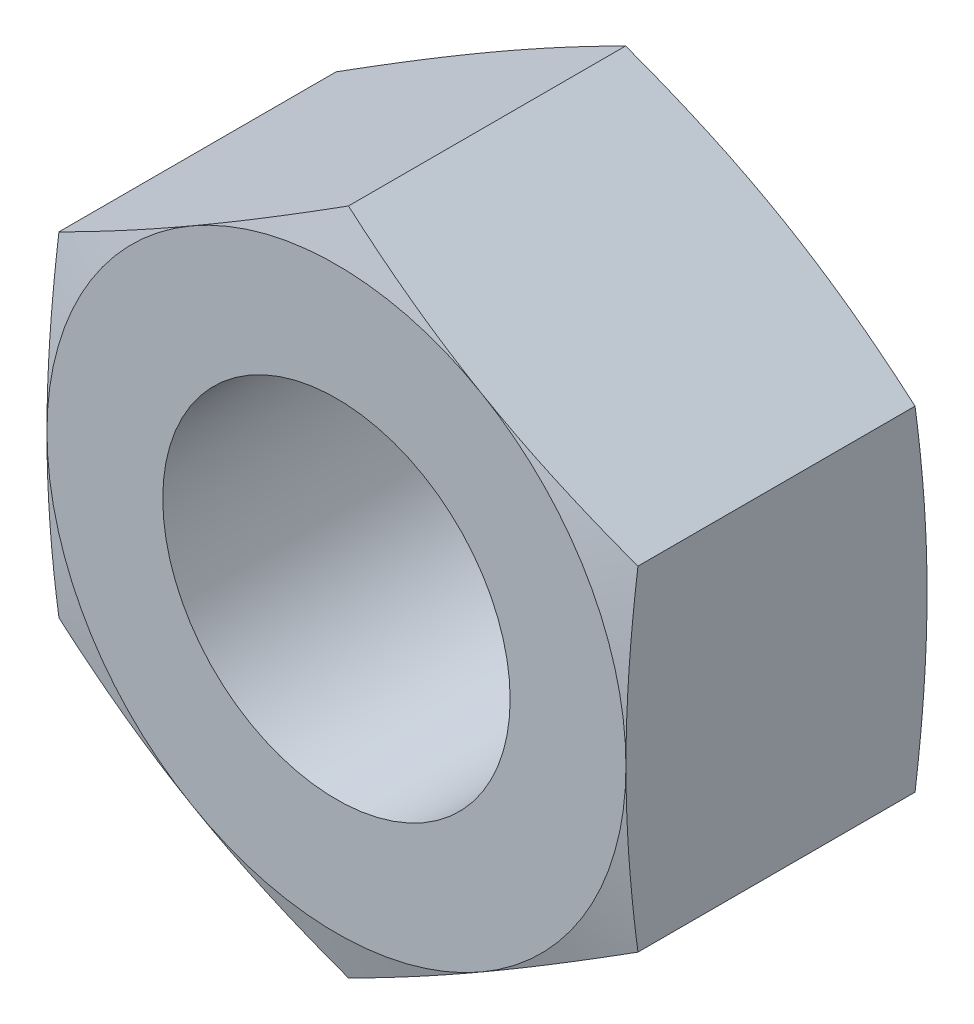
ISO-10303-21;
HEADER;
FILE_DESCRIPTION(('STEP AP214'),'2;1');
FILE_NAME('part.step','',(''),(''),'','','');
FILE_SCHEMA(('AUTOMOTIVE_DESIGN { 1 0 10303 214 1 1 1 1 }'));
ENDSEC;
DATA;
#1=APPLICATION_CONTEXT('core data for automotive mechanical design processes');
#2=APPLICATION_PROTOCOL_DEFINITION('international standard','automotive_design',2000,#1);
#3=PRODUCT_CONTEXT('',#1,'mechanical');
#4=PRODUCT('Part','Part','',(#3));
#5=PRODUCT_RELATED_PRODUCT_CATEGORY('part','',(#4));
#6=PRODUCT_DEFINITION_FORMATION('','',#4);
#7=PRODUCT_DEFINITION_CONTEXT('part definition',#1,'design');
#8=PRODUCT_DEFINITION('design','',#6,#7);
#9=PRODUCT_DEFINITION_SHAPE('','',#8);
#10=(LENGTH_UNIT() NAMED_UNIT(*) SI_UNIT(.MILLI.,.METRE.));
#11=(NAMED_UNIT(*) PLANE_ANGLE_UNIT() SI_UNIT($,.RADIAN.));
#12=(NAMED_UNIT(*) SI_UNIT($,.STERADIAN.) SOLID_ANGLE_UNIT());
#13=UNCERTAINTY_MEASURE_WITH_UNIT(LENGTH_MEASURE(1.E-05),#10,'distance_accuracy_value','');
#14=(GEOMETRIC_REPRESENTATION_CONTEXT(3) GLOBAL_UNCERTAINTY_ASSIGNED_CONTEXT((#13)) GLOBAL_UNIT_ASSIGNED_CONTEXT((#10,
#11,#12)) REPRESENTATION_CONTEXT('',''));
#15=CARTESIAN_POINT('',(0.,0.,0.));
#16=DIRECTION('',(0.,0.,1.));
#17=DIRECTION('',(1.,0.,0.));
#18=AXIS2_PLACEMENT_3D('',#15,#16,#17);
#19=CARTESIAN_POINT('',(5.,2.88675134594813,5.2));
#20=DIRECTION('',(-0.5,-0.866025403784439,0.));
#21=DIRECTION('',(0.866025403784439,-0.5,0.));
#22=AXIS2_PLACEMENT_3D('',#19,#20,#21);
#23=PLANE('',#22);
#24=CARTESIAN_POINT('',(-0.0002,5.7736181619501,0.207290362672768));
#25=CARTESIAN_POINT('',(0.207454004305664,5.65372906666592,0.175152096183013));
#26=CARTESIAN_POINT('',(0.415484518325708,5.53362259339679,0.145975813023445));
#27=CARTESIAN_POINT('',(0.832280248969818,5.29298546611232,0.0947157701800614));
#28=CARTESIAN_POINT('',(1.04104572932974,5.17245465982902,0.0726348915691702));
#29=CARTESIAN_POINT('',(1.45804559853969,4.93169967308862,0.0368547678462025));
#30=CARTESIAN_POINT('',(1.66627716741308,4.81147712074579,0.0231128518667938));
#31=CARTESIAN_POINT('',(2.08300586365709,4.57087869579027,0.00468634420395456));
#32=CARTESIAN_POINT('',(2.29150293182854,4.45050285735623,0.));
#33=CARTESIAN_POINT('',(2.70849706817146,4.20975118048815,0.));
#34=CARTESIAN_POINT('',(2.91699413634292,4.08937534205412,0.00468634420395369));
#35=CARTESIAN_POINT('',(3.33372283258692,3.8487769170986,0.023112851866792));
#36=CARTESIAN_POINT('',(3.54195440146031,3.72855436475577,0.0368547678462003));
#37=CARTESIAN_POINT('',(3.95895427067026,3.48779937801536,0.0726348915691672));
#38=CARTESIAN_POINT('',(4.16771975103018,3.36726857173206,0.0947157701800582));
#39=CARTESIAN_POINT('',(4.58451548167429,3.1266314444476,0.145975813023441));
#40=CARTESIAN_POINT('',(4.79254599569434,3.00652497117847,0.175152096183008));
#41=CARTESIAN_POINT('',(5.0002,2.88663587589429,0.207290362672762));
#42=B_SPLINE_CURVE_WITH_KNOTS('',3,(#24,#25,#26,#27,#28,#29,#30,#31,#32,#33,#34,#35,#36,#37,#38,
#39,#40,#41),.UNSPECIFIED.,.F.,.F.,(4,2,2,2,2,2,2,2,4),(0.,0.725805237679808,1.45190481561532,
2.17425686883392,2.89646911159516,3.6186813543564,4.34103340757501,5.06713298551051,
5.79293822319032),.UNSPECIFIED.);
#43=CARTESIAN_POINT('',(0.,5.77350269189626,0.207259421636907));
#44=VERTEX_POINT('',#43);
#45=CARTESIAN_POINT('',(2.50000000000003,4.33012701892218,0.));
#46=VERTEX_POINT('',#45);
#47=EDGE_CURVE('E49',#44,#46,#42,.T.);
#48=ORIENTED_EDGE('',*,*,#47,.F.);
#49=DIRECTION('',(0.,0.,-1.));
#50=VECTOR('',#49,1.);
#51=CARTESIAN_POINT('',(0.,5.77350269189626,5.2));
#52=LINE('',#51,#50);
#53=CARTESIAN_POINT('',(0.,5.77350269189626,4.99274057836309));
#54=VERTEX_POINT('',#53);
#55=EDGE_CURVE('E164',#54,#44,#52,.T.);
#56=ORIENTED_EDGE('',*,*,#55,.F.);
#57=CARTESIAN_POINT('',(5.0002,2.88663587589429,4.99270963732724));
#58=CARTESIAN_POINT('',(4.79254599569434,3.00652497117847,5.02484790381699));
#59=CARTESIAN_POINT('',(4.58451548167429,3.1266314444476,5.05402418697656));
#60=CARTESIAN_POINT('',(4.16771975103018,3.36726857173206,5.10528422981994));
#61=CARTESIAN_POINT('',(3.95895427067026,3.48779937801536,5.12736510843083));
#62=CARTESIAN_POINT('',(3.54195440146031,3.72855436475577,5.1631452321538));
#63=CARTESIAN_POINT('',(3.33372283258692,3.8487769170986,5.17688714813321));
#64=CARTESIAN_POINT('',(2.91699413634291,4.08937534205412,5.19531365579605));
#65=CARTESIAN_POINT('',(2.70849706817146,4.20975118048815,5.19999999999999));
#66=CARTESIAN_POINT('',(2.29150293182854,4.45050285735623,5.19999999999999));
#67=CARTESIAN_POINT('',(2.08300586365709,4.57087869579027,5.19531365579604));
#68=CARTESIAN_POINT('',(1.66627716741308,4.81147712074579,5.17688714813321));
#69=CARTESIAN_POINT('',(1.45804559853969,4.93169967308862,5.1631452321538));
#70=CARTESIAN_POINT('',(1.04104572932974,5.17245465982902,5.12736510843083));
#71=CARTESIAN_POINT('',(0.832280248969818,5.29298546611232,5.10528422981994));
#72=CARTESIAN_POINT('',(0.415484518325708,5.53362259339679,5.05402418697655));
#73=CARTESIAN_POINT('',(0.207454004305665,5.65372906666592,5.02484790381699));
#74=CARTESIAN_POINT('',(-0.00020000000000044,5.7736181619501,4.99270963732723));
#75=B_SPLINE_CURVE_WITH_KNOTS('',3,(#57,#58,#59,#60,#61,#62,#63,#64,#65,#66,#67,#68,#69,#70,#71,
#72,#73,#74),.UNSPECIFIED.,.F.,.F.,(4,2,2,2,2,2,2,2,4),(0.,0.725805237679808,1.45190481561532,
2.17425686883392,2.89646911159516,3.6186813543564,4.34103340757501,5.06713298551051,
5.79293822319032),.UNSPECIFIED.);
#76=CARTESIAN_POINT('',(2.50000000000001,4.33012701892219,5.19999999999999));
#77=VERTEX_POINT('',#76);
#78=EDGE_CURVE('E223',#77,#54,#75,.T.);
#79=ORIENTED_EDGE('',*,*,#78,.F.);
#80=CARTESIAN_POINT('',(5.,2.88675134594831,4.99274057836346));
#81=VERTEX_POINT('',#80);
#82=EDGE_CURVE('E294',#81,#77,#75,.T.);
#83=ORIENTED_EDGE('',*,*,#82,.F.);
#84=DIRECTION('',(0.,0.,-1.));
#85=VECTOR('',#84,1.);
#86=CARTESIAN_POINT('',(5.,2.88675134594813,5.2));
#87=LINE('',#86,#85);
#88=CARTESIAN_POINT('',(5.,2.88675134594813,0.207259421636902));
#89=VERTEX_POINT('',#88);
#90=EDGE_CURVE('E150',#81,#89,#87,.T.);
#91=ORIENTED_EDGE('',*,*,#90,.T.);
#92=EDGE_CURVE('E143',#46,#89,#42,.T.);
#93=ORIENTED_EDGE('',*,*,#92,.F.);
#94=EDGE_LOOP('',(#48,#56,#79,#83,#91,#93));
#95=FACE_BOUND('',#94,.T.);
#96=ADVANCED_FACE('F33',(#95),#23,.F.);
#97=CARTESIAN_POINT('',(0.,5.77350269189626,5.2));
#98=DIRECTION('',(0.5,-0.866025403784439,0.));
#99=DIRECTION('',(0.866025403784439,0.5,0.));
#100=AXIS2_PLACEMENT_3D('',#97,#98,#99);
#101=PLANE('',#100);
#102=CARTESIAN_POINT('',(-5.0002,2.88663587589429,0.207290362672762));
#103=CARTESIAN_POINT('',(-4.79254599569433,3.00652497117847,0.175152096183008));
#104=CARTESIAN_POINT('',(-4.58451548167429,3.1266314444476,0.14597581302344));
#105=CARTESIAN_POINT('',(-4.16771975103018,3.36726857173206,0.094715770180058));
#106=CARTESIAN_POINT('',(-3.95895427067026,3.48779937801536,0.0726348915691671));
#107=CARTESIAN_POINT('',(-3.54195440146031,3.72855436475577,0.0368547678462002));
#108=CARTESIAN_POINT('',(-3.33372283258692,3.8487769170986,0.0231128518667918));
#109=CARTESIAN_POINT('',(-2.91699413634291,4.08937534205412,0.00468634420395353));
#110=CARTESIAN_POINT('',(-2.70849706817146,4.20975118048815,0.));
#111=CARTESIAN_POINT('',(-2.29150293182854,4.45050285735623,0.));
#112=CARTESIAN_POINT('',(-2.08300586365708,4.57087869579027,0.00468634420395463));
#113=CARTESIAN_POINT('',(-1.66627716741308,4.81147712074579,0.0231128518667938));
#114=CARTESIAN_POINT('',(-1.45804559853969,4.93169967308862,0.0368547678462024));
#115=CARTESIAN_POINT('',(-1.04104572932974,5.17245465982902,0.0726348915691701));
#116=CARTESIAN_POINT('',(-0.832280248969818,5.29298546611232,0.0947157701800615));
#117=CARTESIAN_POINT('',(-0.415484518325707,5.53362259339679,0.145975813023445));
#118=CARTESIAN_POINT('',(-0.207454004305664,5.65372906666592,0.175152096183013));
#119=CARTESIAN_POINT('',(0.000200000000000466,5.7736181619501,0.207290362672768));
#120=B_SPLINE_CURVE_WITH_KNOTS('',3,(#102,#103,#104,#105,#106,#107,#108,#109,#110,#111,#112,
#113,#114,#115,#116,#117,#118,#119),.UNSPECIFIED.,.F.,.F.,(4,2,2,2,2,2,2,2,4),(0.,
0.725805237679807,1.45190481561532,2.17425686883392,2.89646911159516,3.6186813543564,
4.341033407575,5.06713298551051,5.79293822319032),.UNSPECIFIED.);
#121=CARTESIAN_POINT('',(-5.,2.88675134594831,0.207259421636538));
#122=VERTEX_POINT('',#121);
#123=CARTESIAN_POINT('',(-2.49999999999995,4.33012701892223,0.));
#124=VERTEX_POINT('',#123);
#125=EDGE_CURVE('E56',#122,#124,#120,.T.);
#126=ORIENTED_EDGE('',*,*,#125,.F.);
#127=DIRECTION('',(0.,0.,-1.));
#128=VECTOR('',#127,1.);
#129=CARTESIAN_POINT('',(-5.,2.88675134594813,5.2));
#130=LINE('',#129,#128);
#131=CARTESIAN_POINT('',(-5.,2.88675134594813,4.9927405783631));
#132=VERTEX_POINT('',#131);
#133=EDGE_CURVE('E161',#132,#122,#130,.T.);
#134=ORIENTED_EDGE('',*,*,#133,.F.);
#135=CARTESIAN_POINT('',(0.000200000000000032,5.7736181619501,4.99270963732723));
#136=CARTESIAN_POINT('',(-0.207454004305665,5.65372906666592,5.02484790381699));
#137=CARTESIAN_POINT('',(-0.415484518325708,5.53362259339679,5.05402418697655));
#138=CARTESIAN_POINT('',(-0.832280248969818,5.29298546611232,5.10528422981994));
#139=CARTESIAN_POINT('',(-1.04104572932974,5.17245465982902,5.12736510843083));
#140=CARTESIAN_POINT('',(-1.45804559853969,4.93169967308862,5.1631452321538));
#141=CARTESIAN_POINT('',(-1.66627716741308,4.81147712074579,5.17688714813321));
#142=CARTESIAN_POINT('',(-2.08300586365709,4.57087869579027,5.19531365579604));
#143=CARTESIAN_POINT('',(-2.29150293182854,4.45050285735623,5.19999999999999));
#144=CARTESIAN_POINT('',(-2.70849706817146,4.20975118048815,5.19999999999999));
#145=CARTESIAN_POINT('',(-2.91699413634291,4.08937534205412,5.19531365579605));
#146=CARTESIAN_POINT('',(-3.33372283258692,3.8487769170986,5.17688714813321));
#147=CARTESIAN_POINT('',(-3.54195440146031,3.72855436475577,5.1631452321538));
#148=CARTESIAN_POINT('',(-3.95895427067026,3.48779937801536,5.12736510843083));
#149=CARTESIAN_POINT('',(-4.16771975103018,3.36726857173206,5.10528422981994));
#150=CARTESIAN_POINT('',(-4.58451548167429,3.1266314444476,5.05402418697656));
#151=CARTESIAN_POINT('',(-4.79254599569433,3.00652497117847,5.02484790381699));
#152=CARTESIAN_POINT('',(-5.0002,2.88663587589429,4.99270963732724));
#153=B_SPLINE_CURVE_WITH_KNOTS('',3,(#135,#136,#137,#138,#139,#140,#141,#142,#143,#144,#145,
#146,#147,#148,#149,#150,#151,#152),.UNSPECIFIED.,.F.,.F.,(4,2,2,2,2,2,2,2,4),(0.,
0.725805237679808,1.45190481561532,2.17425686883392,2.89646911159516,3.6186813543564,
4.341033407575,5.06713298551051,5.79293822319032),.UNSPECIFIED.);
#154=CARTESIAN_POINT('',(-2.50000000000001,4.33012701892218,5.19999999999999));
#155=VERTEX_POINT('',#154);
#156=EDGE_CURVE('E216',#155,#132,#153,.T.);
#157=ORIENTED_EDGE('',*,*,#156,.F.);
#158=EDGE_CURVE('E221',#54,#155,#153,.T.);
#159=ORIENTED_EDGE('',*,*,#158,.F.);
#160=ORIENTED_EDGE('',*,*,#55,.T.);
#161=EDGE_CURVE('E241',#124,#44,#120,.T.);
#162=ORIENTED_EDGE('',*,*,#161,.F.);
#163=EDGE_LOOP('',(#126,#134,#157,#159,#160,#162));
#164=FACE_BOUND('',#163,.T.);
#165=ADVANCED_FACE('F229',(#164),#101,.F.);
#166=CARTESIAN_POINT('',(-5.,2.88675134594813,5.2));
#167=DIRECTION('',(1.,0.,0.));
#168=DIRECTION('',(0.,0.,-1.));
#169=AXIS2_PLACEMENT_3D('',#166,#167,#168);
#170=PLANE('',#169);
#171=CARTESIAN_POINT('',(-5.,-8.71614548071957,1.35272602911553));
#172=CARTESIAN_POINT('',(-5.,-8.50517178202084,1.30369751464159));
#173=CARTESIAN_POINT('',(-5.,-8.29410295788632,1.25507499520935));
#174=CARTESIAN_POINT('',(-5.,-7.87173515821779,1.15882459396069));
#175=CARTESIAN_POINT('',(-5.,-7.6604361789682,1.11119672845985));
#176=CARTESIAN_POINT('',(-5.,-7.23753268854871,1.01711047025476));
#177=CARTESIAN_POINT('',(-5.,-7.02592812461219,0.970652313953818));
#178=CARTESIAN_POINT('',(-5.,-6.6024125131639,0.879161537356423));
#179=CARTESIAN_POINT('',(-5.,-6.39050146666825,0.834128912344969));
#180=CARTESIAN_POINT('',(-5.,-5.75024834286992,0.700759506089029));
#181=CARTESIAN_POINT('',(-5.,-5.32135127372824,0.615044225670966));
#182=CARTESIAN_POINT('',(-5.,-4.46155937856084,0.453931708322953));
#183=CARTESIAN_POINT('',(-5.,-4.0306643801381,0.378535379591927));
#184=CARTESIAN_POINT('',(-5.,-3.1780351163673,0.245094466846938));
#185=CARTESIAN_POINT('',(-5.,-2.75636838174616,0.186635646797101));
#186=CARTESIAN_POINT('',(-5.,-2.12211174343666,0.114770937262285));
#187=CARTESIAN_POINT('',(-5.,-1.91041927983695,0.0934544967437348));
#188=CARTESIAN_POINT('',(-5.,-1.48651435736496,0.0569212881898627));
#189=CARTESIAN_POINT('',(-5.,-1.27430193557794,0.0417040971840017));
#190=CARTESIAN_POINT('',(-5.,-0.850417950226465,0.0181102252165314));
#191=CARTESIAN_POINT('',(-5.,-0.638748051502393,0.00970406579025167));
#192=CARTESIAN_POINT('',(-5.,-0.215243208172337,4.89659294492869E-05));
#193=CARTESIAN_POINT('',(-5.,-0.0034082643547742,-0.00120000848790474));
#194=CARTESIAN_POINT('',(-5.,0.420195692654403,0.00352629494161619));
#195=CARTESIAN_POINT('',(-5.,0.631964699813662,0.0095021069058838));
#196=CARTESIAN_POINT('',(-5.,1.05518748667662,0.0283659414507137));
#197=CARTESIAN_POINT('',(-5.,1.26664126664026,0.0412539583284184));
#198=CARTESIAN_POINT('',(-5.,1.78023445773328,0.0802632094863383));
#199=CARTESIAN_POINT('',(-5.,2.08212239097341,0.109695187155677));
#200=CARTESIAN_POINT('',(-5.,2.68462938570462,0.179152089281243));
#201=CARTESIAN_POINT('',(-5.,2.98524849340934,0.219176624489041));
#202=CARTESIAN_POINT('',(-5.,3.58620533805987,0.307598597084876));
#203=CARTESIAN_POINT('',(-5.,3.88653918314978,0.356022096383951));
#204=CARTESIAN_POINT('',(-5.,4.48612703405225,0.459159221156393));
#205=CARTESIAN_POINT('',(-5.,4.7853809856308,0.513873158133325));
#206=CARTESIAN_POINT('',(-5.,5.38913044194303,0.629216020438101));
#207=CARTESIAN_POINT('',(-5.,5.69360696243287,0.689943560017453));
#208=CARTESIAN_POINT('',(-5.,6.30179367719117,0.81511802475082));
#209=CARTESIAN_POINT('',(-5.,6.60550386281222,0.879564991681129));
#210=CARTESIAN_POINT('',(-5.,7.2106550215865,1.01092042151158));
#211=CARTESIAN_POINT('',(-5.,7.51209933915072,1.07781354941846));
#212=CARTESIAN_POINT('',(-5.,8.11447382199698,1.21378243523377));
#213=CARTESIAN_POINT('',(-5.,8.41540402192394,1.28285803942017));
#214=CARTESIAN_POINT('',(-5.,8.71614548071957,1.35272602911558));
#215=B_SPLINE_CURVE_WITH_KNOTS('',3,(#171,#172,#173,#174,#175,#176,#177,#178,#179,#180,#181,
#182,#183,#184,#185,#186,#187,#188,#189,#190,#191,#192,#193,#194,#195,#196,#197,#198,#199,#200,
#201,#202,#203,#204,#205,#206,#207,#208,#209,#210,#211,#212,#213,#214),.UNSPECIFIED.,.F.,.F.,(4,
2,2,2,2,2,2,2,2,2,2,2,2,2,2,2,2,2,2,2,2,4),(0.,0.649787739274153,1.29958612882694,
1.94951480807061,2.59944133742483,3.91148628345778,5.22364663196657,6.50030918508801,
7.13852534955031,7.77669724735986,8.41209212768122,9.04748399109928,9.68292283093722,
10.3183611465124,11.2280691033631,12.1377436354969,13.0502930986724,13.9628877709358,
14.8942778795871,15.8256784515706,16.7520012407517,17.6782589294994),.UNSPECIFIED.);
#216=CARTESIAN_POINT('',(-5.,-2.88675134594813,0.207259421636889));
#217=VERTEX_POINT('',#216);
#218=CARTESIAN_POINT('',(-5.,0.,0.));
#219=VERTEX_POINT('',#218);
#220=EDGE_CURVE('E243',#217,#219,#215,.T.);
#221=ORIENTED_EDGE('',*,*,#220,.F.);
#222=DIRECTION('',(0.,0.,-1.));
#223=VECTOR('',#222,1.);
#224=CARTESIAN_POINT('',(-5.,-2.88675134594813,5.2));
#225=LINE('',#224,#223);
#226=CARTESIAN_POINT('',(-5.,-2.88675134594813,4.99274057836311));
#227=VERTEX_POINT('',#226);
#228=EDGE_CURVE('E152',#227,#217,#225,.T.);
#229=ORIENTED_EDGE('',*,*,#228,.F.);
#230=CARTESIAN_POINT('',(-5.,8.71614548071957,3.84727397088442));
#231=CARTESIAN_POINT('',(-5.,8.50517178202084,3.89630248535836));
#232=CARTESIAN_POINT('',(-5.,8.29410295788633,3.94492500479061));
#233=CARTESIAN_POINT('',(-5.,7.87173515821779,4.04117540603927));
#234=CARTESIAN_POINT('',(-5.,7.66043617896821,4.08880327154011));
#235=CARTESIAN_POINT('',(-5.,7.23753268854872,4.1828895297452));
#236=CARTESIAN_POINT('',(-5.,7.0259281246122,4.22934768604614));
#237=CARTESIAN_POINT('',(-5.,6.60241251316391,4.32083846264354));
#238=CARTESIAN_POINT('',(-5.,6.39050146666826,4.365871087655));
#239=CARTESIAN_POINT('',(-5.,5.75024834286994,4.49924049391094));
#240=CARTESIAN_POINT('',(-5.,5.32135127372826,4.58495577432901));
#241=CARTESIAN_POINT('',(-5.,4.46155937856086,4.74606829167702));
#242=CARTESIAN_POINT('',(-5.,4.03066438013812,4.82146462040805));
#243=CARTESIAN_POINT('',(-5.,3.17803511636733,4.95490553315304));
#244=CARTESIAN_POINT('',(-5.,2.75636838174619,5.01336435320288));
#245=CARTESIAN_POINT('',(-5.,2.12211174343669,5.0852290627377));
#246=CARTESIAN_POINT('',(-5.,1.91041927983699,5.10654550325625));
#247=CARTESIAN_POINT('',(-5.,1.486514357365,5.14307871181013));
#248=CARTESIAN_POINT('',(-5.,1.27430193557798,5.15829590281599));
#249=CARTESIAN_POINT('',(-5.,0.850417950226507,5.18188977478346));
#250=CARTESIAN_POINT('',(-5.,0.638748051502436,5.19029593420974));
#251=CARTESIAN_POINT('',(-5.,0.215243208172382,5.19995103407055));
#252=CARTESIAN_POINT('',(-5.,0.00340826435482006,5.2012000084879));
#253=CARTESIAN_POINT('',(-5.,-0.420195692654356,5.19647370505839));
#254=CARTESIAN_POINT('',(-5.,-0.631964699813614,5.19049789309412));
#255=CARTESIAN_POINT('',(-5.,-1.05518748667657,5.17163405854929));
#256=CARTESIAN_POINT('',(-5.,-1.26664126664021,5.15874604167159));
#257=CARTESIAN_POINT('',(-5.,-1.78023445773323,5.11973679051367));
#258=CARTESIAN_POINT('',(-5.,-2.08212239097337,5.09030481284434));
#259=CARTESIAN_POINT('',(-5.,-2.68462938570457,5.02084791071877));
#260=CARTESIAN_POINT('',(-5.,-2.9852484934093,4.98082337551098));
#261=CARTESIAN_POINT('',(-5.,-3.58620533805983,4.89240140291514));
#262=CARTESIAN_POINT('',(-5.,-3.88653918314974,4.84397790361607));
#263=CARTESIAN_POINT('',(-5.,-4.48612703405222,4.74084077884363));
#264=CARTESIAN_POINT('',(-5.,-4.78538098563077,4.6861268418667));
#265=CARTESIAN_POINT('',(-5.,-5.38913044194301,4.57078397956193));
#266=CARTESIAN_POINT('',(-5.,-5.69360696243285,4.51005643998258));
#267=CARTESIAN_POINT('',(-5.,-6.30179367719116,4.38488197524921));
#268=CARTESIAN_POINT('',(-5.,-6.60550386281221,4.32043500831891));
#269=CARTESIAN_POINT('',(-5.,-7.21065502158649,4.18907957848846));
#270=CARTESIAN_POINT('',(-5.,-7.51209933915071,4.12218645058158));
#271=CARTESIAN_POINT('',(-5.,-8.11447382199698,3.98621756476627));
#272=CARTESIAN_POINT('',(-5.,-8.41540402192395,3.91714196057987));
#273=CARTESIAN_POINT('',(-5.,-8.71614548071957,3.84727397088447));
#274=B_SPLINE_CURVE_WITH_KNOTS('',3,(#230,#231,#232,#233,#234,#235,#236,#237,#238,#239,#240,
#241,#242,#243,#244,#245,#246,#247,#248,#249,#250,#251,#252,#253,#254,#255,#256,#257,#258,#259,
#260,#261,#262,#263,#264,#265,#266,#267,#268,#269,#270,#271,#272,#273),.UNSPECIFIED.,.F.,.F.,(4,
2,2,2,2,2,2,2,2,2,2,2,2,2,2,2,2,2,2,2,2,4),(0.,0.64978773927415,1.29958612882693,
1.9495148080706,2.59944133742482,3.91148628345776,5.22364663196655,6.50030918508798,
7.13852534955028,7.77669724735983,8.41209212768118,9.04748399109925,9.68292283093717,
10.3183611465124,11.2280691033631,12.1377436354968,13.0502930986723,13.9628877709358,
14.8942778795871,15.8256784515706,16.7520012407517,17.6782589294994),.UNSPECIFIED.);
#275=CARTESIAN_POINT('',(-5.,0.,5.2));
#276=VERTEX_POINT('',#275);
#277=EDGE_CURVE('E209',#276,#227,#274,.T.);
#278=ORIENTED_EDGE('',*,*,#277,.F.);
#279=EDGE_CURVE('E222',#132,#276,#274,.T.);
#280=ORIENTED_EDGE('',*,*,#279,.F.);
#281=ORIENTED_EDGE('',*,*,#133,.T.);
#282=EDGE_CURVE('E242',#219,#122,#215,.T.);
#283=ORIENTED_EDGE('',*,*,#282,.F.);
#284=EDGE_LOOP('',(#221,#229,#278,#280,#281,#283));
#285=FACE_BOUND('',#284,.T.);
#286=ADVANCED_FACE('F232',(#285),#170,.F.);
#287=CARTESIAN_POINT('',(-5.,-2.88675134594813,5.2));
#288=DIRECTION('',(0.5,0.866025403784439,0.));
#289=DIRECTION('',(-0.866025403784439,0.5,0.));
#290=AXIS2_PLACEMENT_3D('',#287,#288,#289);
#291=PLANE('',#290);
#292=CARTESIAN_POINT('',(0.000199999999999583,-5.7736181619501,0.207290362672743));
#293=CARTESIAN_POINT('',(-0.207454004305665,-5.65372906666592,0.17515209618299));
#294=CARTESIAN_POINT('',(-0.415484518325708,-5.53362259339679,0.145975813023422));
#295=CARTESIAN_POINT('',(-0.832280248969819,-5.29298546611232,0.0947157701800408));
#296=CARTESIAN_POINT('',(-1.04104572932974,-5.17245465982902,0.0726348915691501));
#297=CARTESIAN_POINT('',(-1.45804559853969,-4.93169967308862,0.0368547678461838));
#298=CARTESIAN_POINT('',(-1.66627716741308,-4.81147712074579,0.0231128518667757));
#299=CARTESIAN_POINT('',(-2.08300586365709,-4.57087869579027,0.00468634420393745));
#300=CARTESIAN_POINT('',(-2.29150293182854,-4.45050285735623,0.));
#301=CARTESIAN_POINT('',(-2.70849706817146,-4.20975118048815,0.));
#302=CARTESIAN_POINT('',(-2.91699413634292,-4.08937534205412,0.00468634420393824));
#303=CARTESIAN_POINT('',(-3.33372283258692,-3.8487769170986,0.0231128518667773));
#304=CARTESIAN_POINT('',(-3.54195440146031,-3.72855436475577,0.0368547678461859));
#305=CARTESIAN_POINT('',(-3.95895427067026,-3.48779937801536,0.0726348915691533));
#306=CARTESIAN_POINT('',(-4.16771975103018,-3.36726857173206,0.0947157701800444));
#307=CARTESIAN_POINT('',(-4.58451548167429,-3.1266314444476,0.145975813023427));
#308=CARTESIAN_POINT('',(-4.79254599569433,-3.00652497117847,0.175152096182995));
#309=CARTESIAN_POINT('',(-5.0002,-2.88663587589429,0.207290362672749));
#310=B_SPLINE_CURVE_WITH_KNOTS('',3,(#292,#293,#294,#295,#296,#297,#298,#299,#300,#301,#302,
#303,#304,#305,#306,#307,#308,#309),.UNSPECIFIED.,.F.,.F.,(4,2,2,2,2,2,2,2,4),(0.,
0.725805237679807,1.45190481561532,2.17425686883392,2.89646911159516,3.6186813543564,
4.341033407575,5.06713298551051,5.79293822319032),.UNSPECIFIED.);
#311=CARTESIAN_POINT('',(0.,-5.77350269189626,0.207259421636883));
#312=VERTEX_POINT('',#311);
#313=CARTESIAN_POINT('',(-2.49999999999997,-4.33012701892221,0.));
#314=VERTEX_POINT('',#313);
#315=EDGE_CURVE('E250',#312,#314,#310,.T.);
#316=ORIENTED_EDGE('',*,*,#315,.F.);
#317=DIRECTION('',(0.,0.,-1.));
#318=VECTOR('',#317,1.);
#319=CARTESIAN_POINT('',(0.,-5.77350269189626,5.2));
#320=LINE('',#319,#318);
#321=CARTESIAN_POINT('',(0.,-5.77350269189626,4.99274057836312));
#322=VERTEX_POINT('',#321);
#323=EDGE_CURVE('E149',#322,#312,#320,.T.);
#324=ORIENTED_EDGE('',*,*,#323,.F.);
#325=CARTESIAN_POINT('',(-5.0002,-2.88663587589429,4.99270963732725));
#326=CARTESIAN_POINT('',(-4.79254599569433,-3.00652497117847,5.024847903817));
#327=CARTESIAN_POINT('',(-4.58451548167429,-3.1266314444476,5.05402418697657));
#328=CARTESIAN_POINT('',(-4.16771975103018,-3.36726857173206,5.10528422981996));
#329=CARTESIAN_POINT('',(-3.95895427067026,-3.48779937801536,5.12736510843085));
#330=CARTESIAN_POINT('',(-3.54195440146031,-3.72855436475577,5.16314523215381));
#331=CARTESIAN_POINT('',(-3.33372283258692,-3.8487769170986,5.17688714813322));
#332=CARTESIAN_POINT('',(-2.91699413634291,-4.08937534205412,5.19531365579606));
#333=CARTESIAN_POINT('',(-2.70849706817146,-4.20975118048815,5.20000000000001));
#334=CARTESIAN_POINT('',(-2.29150293182854,-4.45050285735623,5.20000000000001));
#335=CARTESIAN_POINT('',(-2.08300586365709,-4.57087869579027,5.19531365579606));
#336=CARTESIAN_POINT('',(-1.66627716741308,-4.81147712074579,5.17688714813322));
#337=CARTESIAN_POINT('',(-1.45804559853969,-4.93169967308862,5.16314523215382));
#338=CARTESIAN_POINT('',(-1.04104572932974,-5.17245465982902,5.12736510843085));
#339=CARTESIAN_POINT('',(-0.832280248969819,-5.29298546611232,5.10528422981996));
#340=CARTESIAN_POINT('',(-0.415484518325709,-5.53362259339679,5.05402418697658));
#341=CARTESIAN_POINT('',(-0.207454004305666,-5.65372906666592,5.02484790381701));
#342=CARTESIAN_POINT('',(0.000199999999999151,-5.7736181619501,4.99270963732726));
#343=B_SPLINE_CURVE_WITH_KNOTS('',3,(#325,#326,#327,#328,#329,#330,#331,#332,#333,#334,#335,
#336,#337,#338,#339,#340,#341,#342),.UNSPECIFIED.,.F.,.F.,(4,2,2,2,2,2,2,2,4),(0.,
0.725805237679807,1.45190481561532,2.17425686883392,2.89646911159516,3.6186813543564,
4.341033407575,5.06713298551051,5.79293822319032),.UNSPECIFIED.);
#344=CARTESIAN_POINT('',(-2.49999999999998,-4.3301270189222,5.20000000000001));
#345=VERTEX_POINT('',#344);
#346=EDGE_CURVE('E202',#345,#322,#343,.T.);
#347=ORIENTED_EDGE('',*,*,#346,.F.);
#348=EDGE_CURVE('E320',#227,#345,#343,.T.);
#349=ORIENTED_EDGE('',*,*,#348,.F.);
#350=ORIENTED_EDGE('',*,*,#228,.T.);
#351=EDGE_CURVE('E249',#314,#217,#310,.T.);
#352=ORIENTED_EDGE('',*,*,#351,.F.);
#353=EDGE_LOOP('',(#316,#324,#347,#349,#350,#352));
#354=FACE_BOUND('',#353,.T.);
#355=ADVANCED_FACE('F260',(#354),#291,.F.);
#356=CARTESIAN_POINT('',(0.,-5.77350269189626,5.2));
#357=DIRECTION('',(-0.5,0.866025403784439,0.));
#358=DIRECTION('',(-0.866025403784439,-0.5,0.));
#359=AXIS2_PLACEMENT_3D('',#356,#357,#358);
#360=PLANE('',#359);
#361=CARTESIAN_POINT('',(5.0002,-2.88663587589429,0.20729036267275));
#362=CARTESIAN_POINT('',(4.79254599569434,-3.00652497117847,0.175152096182995));
#363=CARTESIAN_POINT('',(4.58451548167429,-3.1266314444476,0.145975813023428));
#364=CARTESIAN_POINT('',(4.16771975103018,-3.36726857173206,0.0947157701800448));
#365=CARTESIAN_POINT('',(3.95895427067026,-3.48779937801536,0.0726348915691536));
#366=CARTESIAN_POINT('',(3.54195440146031,-3.72855436475577,0.0368547678461862));
#367=CARTESIAN_POINT('',(3.33372283258692,-3.8487769170986,0.0231128518667776));
#368=CARTESIAN_POINT('',(2.91699413634291,-4.08937534205412,0.00468634420393842));
#369=CARTESIAN_POINT('',(2.70849706817146,-4.20975118048816,0.));
#370=CARTESIAN_POINT('',(2.29150293182854,-4.45050285735623,0.));
#371=CARTESIAN_POINT('',(2.08300586365708,-4.57087869579027,0.00468634420393754));
#372=CARTESIAN_POINT('',(1.66627716741308,-4.81147712074579,0.0231128518667757));
#373=CARTESIAN_POINT('',(1.45804559853969,-4.93169967308862,0.0368547678461838));
#374=CARTESIAN_POINT('',(1.04104572932974,-5.17245465982902,0.0726348915691502));
#375=CARTESIAN_POINT('',(0.832280248969818,-5.29298546611232,0.0947157701800408));
#376=CARTESIAN_POINT('',(0.415484518325707,-5.53362259339679,0.145975813023423));
#377=CARTESIAN_POINT('',(0.207454004305663,-5.65372906666592,0.17515209618299));
#378=CARTESIAN_POINT('',(-0.000200000000001073,-5.7736181619501,0.207290362672744));
#379=B_SPLINE_CURVE_WITH_KNOTS('',3,(#361,#362,#363,#364,#365,#366,#367,#368,#369,#370,#371,
#372,#373,#374,#375,#376,#377,#378),.UNSPECIFIED.,.F.,.F.,(4,2,2,2,2,2,2,2,4),(0.,
0.725805237679808,1.45190481561532,2.17425686883392,2.89646911159516,3.6186813543564,
4.34103340757501,5.06713298551051,5.79293822319032),.UNSPECIFIED.);
#380=CARTESIAN_POINT('',(5.,-2.88675134594831,0.207259421636527));
#381=VERTEX_POINT('',#380);
#382=CARTESIAN_POINT('',(2.50000000000005,-4.33012701892216,0.));
#383=VERTEX_POINT('',#382);
#384=EDGE_CURVE('E127',#381,#383,#379,.T.);
#385=ORIENTED_EDGE('',*,*,#384,.F.);
#386=DIRECTION('',(0.,0.,-1.));
#387=VECTOR('',#386,1.);
#388=CARTESIAN_POINT('',(5.,-2.88675134594813,5.2));
#389=LINE('',#388,#387);
#390=CARTESIAN_POINT('',(5.,-2.88675134594813,4.99274057836311));
#391=VERTEX_POINT('',#390);
#392=EDGE_CURVE('E140',#391,#381,#389,.T.);
#393=ORIENTED_EDGE('',*,*,#392,.F.);
#394=CARTESIAN_POINT('',(-0.0002000000000005,-5.7736181619501,4.99270963732726));
#395=CARTESIAN_POINT('',(0.207454004305664,-5.65372906666592,5.02484790381701));
#396=CARTESIAN_POINT('',(0.415484518325707,-5.53362259339679,5.05402418697658));
#397=CARTESIAN_POINT('',(0.832280248969818,-5.29298546611232,5.10528422981996));
#398=CARTESIAN_POINT('',(1.04104572932974,-5.17245465982902,5.12736510843085));
#399=CARTESIAN_POINT('',(1.45804559853969,-4.93169967308862,5.16314523215382));
#400=CARTESIAN_POINT('',(1.66627716741308,-4.81147712074579,5.17688714813322));
#401=CARTESIAN_POINT('',(2.08300586365708,-4.57087869579027,5.19531365579606));
#402=CARTESIAN_POINT('',(2.29150293182854,-4.45050285735623,5.20000000000001));
#403=CARTESIAN_POINT('',(2.70849706817146,-4.20975118048815,5.20000000000001));
#404=CARTESIAN_POINT('',(2.91699413634292,-4.08937534205412,5.19531365579606));
#405=CARTESIAN_POINT('',(3.33372283258692,-3.8487769170986,5.17688714813322));
#406=CARTESIAN_POINT('',(3.54195440146031,-3.72855436475577,5.16314523215381));
#407=CARTESIAN_POINT('',(3.95895427067026,-3.48779937801537,5.12736510843085));
#408=CARTESIAN_POINT('',(4.16771975103018,-3.36726857173206,5.10528422981996));
#409=CARTESIAN_POINT('',(4.58451548167429,-3.1266314444476,5.05402418697657));
#410=CARTESIAN_POINT('',(4.79254599569433,-3.00652497117847,5.024847903817));
#411=CARTESIAN_POINT('',(5.0002,-2.88663587589429,4.99270963732725));
#412=B_SPLINE_CURVE_WITH_KNOTS('',3,(#394,#395,#396,#397,#398,#399,#400,#401,#402,#403,#404,
#405,#406,#407,#408,#409,#410,#411),.UNSPECIFIED.,.F.,.F.,(4,2,2,2,2,2,2,2,4),(0.,
0.725805237679808,1.45190481561532,2.17425686883392,2.89646911159516,3.6186813543564,
4.341033407575,5.06713298551051,5.79293822319032),.UNSPECIFIED.);
#413=CARTESIAN_POINT('',(2.49999999999998,-4.3301270189222,5.20000000000001));
#414=VERTEX_POINT('',#413);
#415=EDGE_CURVE('E194',#414,#391,#412,.T.);
#416=ORIENTED_EDGE('',*,*,#415,.F.);
#417=EDGE_CURVE('E328',#322,#414,#412,.T.);
#418=ORIENTED_EDGE('',*,*,#417,.F.);
#419=ORIENTED_EDGE('',*,*,#323,.T.);
#420=EDGE_CURVE('E142',#383,#312,#379,.T.);
#421=ORIENTED_EDGE('',*,*,#420,.F.);
#422=EDGE_LOOP('',(#385,#393,#416,#418,#419,#421));
#423=FACE_BOUND('',#422,.T.);
#424=ADVANCED_FACE('F138',(#423),#360,.F.);
#425=CARTESIAN_POINT('',(5.,-2.88675134594813,5.2));
#426=DIRECTION('',(-1.,0.,0.));
#427=DIRECTION('',(0.,0.,1.));
#428=AXIS2_PLACEMENT_3D('',#425,#426,#427);
#429=PLANE('',#428);
#430=CARTESIAN_POINT('',(5.,8.71614548071957,1.35272602911558));
#431=CARTESIAN_POINT('',(5.,8.50517178202084,1.30369751464164));
#432=CARTESIAN_POINT('',(5.,8.29410295788633,1.25507499520939));
#433=CARTESIAN_POINT('',(5.,7.87173515821779,1.15882459396073));
#434=CARTESIAN_POINT('',(5.,7.6604361789682,1.11119672845989));
#435=CARTESIAN_POINT('',(5.,7.23753268854871,1.0171104702548));
#436=CARTESIAN_POINT('',(5.,7.0259281246122,0.970652313953855));
#437=CARTESIAN_POINT('',(5.,6.60241251316391,0.879161537356458));
#438=CARTESIAN_POINT('',(5.,6.39050146666826,0.834128912345004));
#439=CARTESIAN_POINT('',(5.,5.75024834286993,0.700759506089061));
#440=CARTESIAN_POINT('',(5.,5.32135127372826,0.615044225670995));
#441=CARTESIAN_POINT('',(5.,4.46155937856086,0.453931708322978));
#442=CARTESIAN_POINT('',(5.,4.03066438013812,0.378535379591949));
#443=CARTESIAN_POINT('',(5.,3.17803511636733,0.245094466846956));
#444=CARTESIAN_POINT('',(5.,2.75636838174619,0.186635646797117));
#445=CARTESIAN_POINT('',(5.,2.12211174343669,0.114770937262297));
#446=CARTESIAN_POINT('',(5.,1.91041927983699,0.093454496743746));
#447=CARTESIAN_POINT('',(5.,1.486514357365,0.0569212881898719));
#448=CARTESIAN_POINT('',(5.,1.27430193557797,0.0417040971840099));
#449=CARTESIAN_POINT('',(5.,0.850417950226506,0.0181102252165372));
#450=CARTESIAN_POINT('',(5.,0.638748051502435,0.00970406579025597));
#451=CARTESIAN_POINT('',(5.,0.215243208172381,4.89659294510241E-05));
#452=CARTESIAN_POINT('',(5.,0.00340826435481865,-0.00120000848790401));
#453=CARTESIAN_POINT('',(5.,-0.420195692654358,0.0035262949416143));
#454=CARTESIAN_POINT('',(5.,-0.631964699813616,0.00950210690588031));
#455=CARTESIAN_POINT('',(5.,-1.05518748667658,0.0283659414507075));
#456=CARTESIAN_POINT('',(5.,-1.26664126664021,0.0412539583284111));
#457=CARTESIAN_POINT('',(5.,-1.78023445773323,0.0802632094863279));
#458=CARTESIAN_POINT('',(5.,-2.08212239097337,0.109695187155664));
#459=CARTESIAN_POINT('',(5.,-2.68462938570458,0.179152089281227));
#460=CARTESIAN_POINT('',(5.,-2.9852484934093,0.219176624489024));
#461=CARTESIAN_POINT('',(5.,-3.58620533805983,0.307598597084856));
#462=CARTESIAN_POINT('',(5.,-3.88653918314975,0.356022096383929));
#463=CARTESIAN_POINT('',(5.,-4.48612703405222,0.459159221156368));
#464=CARTESIAN_POINT('',(5.,-4.78538098563077,0.513873158133299));
#465=CARTESIAN_POINT('',(5.,-5.38913044194301,0.629216020438071));
#466=CARTESIAN_POINT('',(5.,-5.69360696243285,0.689943560017422));
#467=CARTESIAN_POINT('',(5.,-6.30179367719116,0.815118024750786));
#468=CARTESIAN_POINT('',(5.,-6.60550386281221,0.879564991681093));
#469=CARTESIAN_POINT('',(5.,-7.21065502158649,1.01092042151154));
#470=CARTESIAN_POINT('',(5.,-7.51209933915071,1.07781354941842));
#471=CARTESIAN_POINT('',(5.,-8.11447382199698,1.21378243523373));
#472=CARTESIAN_POINT('',(5.,-8.41540402192395,1.28285803942013));
#473=CARTESIAN_POINT('',(5.,-8.71614548071957,1.35272602911553));
#474=B_SPLINE_CURVE_WITH_KNOTS('',3,(#430,#431,#432,#433,#434,#435,#436,#437,#438,#439,#440,
#441,#442,#443,#444,#445,#446,#447,#448,#449,#450,#451,#452,#453,#454,#455,#456,#457,#458,#459,
#460,#461,#462,#463,#464,#465,#466,#467,#468,#469,#470,#471,#472,#473),.UNSPECIFIED.,.F.,.F.,(4,
2,2,2,2,2,2,2,2,2,2,2,2,2,2,2,2,2,2,2,2,4),(0.,0.649787739274148,1.29958612882693,
1.9495148080706,2.59944133742482,3.91148628345776,5.22364663196655,6.50030918508798,
7.13852534955028,7.77669724735983,8.41209212768118,9.04748399109925,9.68292283093718,
10.3183611465124,11.2280691033631,12.1377436354968,13.0502930986723,13.9628877709358,
14.8942778795871,15.8256784515706,16.7520012407517,17.6782589294994),.UNSPECIFIED.);
#475=CARTESIAN_POINT('',(5.,0.,0.));
#476=VERTEX_POINT('',#475);
#477=EDGE_CURVE('E134',#89,#476,#474,.T.);
#478=ORIENTED_EDGE('',*,*,#477,.F.);
#479=ORIENTED_EDGE('',*,*,#90,.F.);
#480=CARTESIAN_POINT('',(5.,-8.71614548071957,3.84727397088447));
#481=CARTESIAN_POINT('',(5.,-8.50517178202084,3.89630248535841));
#482=CARTESIAN_POINT('',(5.,-8.29410295788632,3.94492500479065));
#483=CARTESIAN_POINT('',(5.,-7.87173515821779,4.04117540603931));
#484=CARTESIAN_POINT('',(5.,-7.6604361789682,4.08880327154015));
#485=CARTESIAN_POINT('',(5.,-7.23753268854871,4.18288952974524));
#486=CARTESIAN_POINT('',(5.,-7.02592812461219,4.22934768604618));
#487=CARTESIAN_POINT('',(5.,-6.6024125131639,4.32083846264358));
#488=CARTESIAN_POINT('',(5.,-6.39050146666825,4.36587108765503));
#489=CARTESIAN_POINT('',(5.,-5.75024834286992,4.49924049391097));
#490=CARTESIAN_POINT('',(5.,-5.32135127372824,4.58495577432903));
#491=CARTESIAN_POINT('',(5.,-4.46155937856084,4.74606829167705));
#492=CARTESIAN_POINT('',(5.,-4.03066438013809,4.82146462040807));
#493=CARTESIAN_POINT('',(5.,-3.1780351163673,4.95490553315306));
#494=CARTESIAN_POINT('',(5.,-2.75636838174616,5.0133643532029));
#495=CARTESIAN_POINT('',(5.,-2.12211174343666,5.08522906273771));
#496=CARTESIAN_POINT('',(5.,-1.91041927983695,5.10654550325627));
#497=CARTESIAN_POINT('',(5.,-1.48651435736496,5.14307871181014));
#498=CARTESIAN_POINT('',(5.,-1.27430193557794,5.158295902816));
#499=CARTESIAN_POINT('',(5.,-0.850417950226466,5.18188977478347));
#500=CARTESIAN_POINT('',(5.,-0.638748051502394,5.19029593420975));
#501=CARTESIAN_POINT('',(5.,-0.215243208172337,5.19995103407055));
#502=CARTESIAN_POINT('',(5.,-0.00340826435477447,5.2012000084879));
#503=CARTESIAN_POINT('',(5.,0.420195692654404,5.19647370505838));
#504=CARTESIAN_POINT('',(5.,0.631964699813663,5.19049789309411));
#505=CARTESIAN_POINT('',(5.,1.05518748667662,5.17163405854928));
#506=CARTESIAN_POINT('',(5.,1.26664126664026,5.15874604167158));
#507=CARTESIAN_POINT('',(5.,1.78023445773328,5.11973679051366));
#508=CARTESIAN_POINT('',(5.,2.08212239097341,5.09030481284432));
#509=CARTESIAN_POINT('',(5.,2.68462938570462,5.02084791071876));
#510=CARTESIAN_POINT('',(5.,2.98524849340934,4.98082337551096));
#511=CARTESIAN_POINT('',(5.,3.58620533805986,4.89240140291512));
#512=CARTESIAN_POINT('',(5.,3.88653918314978,4.84397790361605));
#513=CARTESIAN_POINT('',(5.,4.48612703405225,4.74084077884361));
#514=CARTESIAN_POINT('',(5.,4.7853809856308,4.68612684186667));
#515=CARTESIAN_POINT('',(5.,5.38913044194303,4.5707839795619));
#516=CARTESIAN_POINT('',(5.,5.69360696243287,4.51005643998255));
#517=CARTESIAN_POINT('',(5.,6.30179367719117,4.38488197524918));
#518=CARTESIAN_POINT('',(5.,6.60550386281222,4.32043500831887));
#519=CARTESIAN_POINT('',(5.,7.21065502158649,4.18907957848842));
#520=CARTESIAN_POINT('',(5.,7.51209933915071,4.12218645058154));
#521=CARTESIAN_POINT('',(5.,8.11447382199698,3.98621756476623));
#522=CARTESIAN_POINT('',(5.,8.41540402192394,3.91714196057983));
#523=CARTESIAN_POINT('',(5.,8.71614548071957,3.84727397088442));
#524=B_SPLINE_CURVE_WITH_KNOTS('',3,(#480,#481,#482,#483,#484,#485,#486,#487,#488,#489,#490,
#491,#492,#493,#494,#495,#496,#497,#498,#499,#500,#501,#502,#503,#504,#505,#506,#507,#508,#509,
#510,#511,#512,#513,#514,#515,#516,#517,#518,#519,#520,#521,#522,#523),.UNSPECIFIED.,.F.,.F.,(4,
2,2,2,2,2,2,2,2,2,2,2,2,2,2,2,2,2,2,2,2,4),(0.,0.649787739274153,1.29958612882694,
1.94951480807061,2.59944133742483,3.91148628345778,5.22364663196657,6.50030918508801,
7.13852534955031,7.77669724735986,8.41209212768122,9.04748399109928,9.68292283093722,
10.3183611465124,11.2280691033631,12.1377436354969,13.0502930986724,13.9628877709358,
14.8942778795871,15.8256784515706,16.7520012407517,17.6782589294994),.UNSPECIFIED.);
#525=CARTESIAN_POINT('',(5.,0.,5.2));
#526=VERTEX_POINT('',#525);
#527=EDGE_CURVE('E166',#526,#81,#524,.T.);
#528=ORIENTED_EDGE('',*,*,#527,.F.);
#529=EDGE_CURVE('E148',#391,#526,#524,.T.);
#530=ORIENTED_EDGE('',*,*,#529,.F.);
#531=ORIENTED_EDGE('',*,*,#392,.T.);
#532=EDGE_CURVE('E124',#476,#381,#474,.T.);
#533=ORIENTED_EDGE('',*,*,#532,.F.);
#534=EDGE_LOOP('',(#478,#479,#528,#530,#531,#533));
#535=FACE_BOUND('',#534,.T.);
#536=ADVANCED_FACE('F146',(#535),#429,.F.);
#537=CARTESIAN_POINT('',(0.,0.,0.));
#538=DIRECTION('',(0.,0.,1.));
#539=DIRECTION('',(1.,0.,0.));
#540=AXIS2_PLACEMENT_3D('',#537,#538,#539);
#541=PLANE('',#540);
#542=CARTESIAN_POINT('',(0.,0.,0.));
#543=DIRECTION('',(0.,0.,1.));
#544=DIRECTION('',(1.,0.,0.));
#545=AXIS2_PLACEMENT_3D('',#542,#543,#544);
#546=CIRCLE('',#545,3.);
#547=CARTESIAN_POINT('',(3.,0.,0.));
#548=VERTEX_POINT('',#547);
#549=EDGE_CURVE('E306',#548,#548,#546,.T.);
#550=ORIENTED_EDGE('',*,*,#549,.T.);
#551=EDGE_LOOP('',(#550));
#552=FACE_BOUND('',#551,.T.);
#553=CARTESIAN_POINT('',(0.,0.,0.));
#554=DIRECTION('',(0.,0.,1.));
#555=DIRECTION('',(1.,0.,0.));
#556=AXIS2_PLACEMENT_3D('',#553,#554,#555);
#557=CIRCLE('',#556,5.);
#558=EDGE_CURVE('E11',#476,#46,#557,.T.);
#559=ORIENTED_EDGE('',*,*,#558,.F.);
#560=EDGE_CURVE('E37',#383,#476,#557,.T.);
#561=ORIENTED_EDGE('',*,*,#560,.F.);
#562=EDGE_CURVE('E340',#314,#383,#557,.T.);
#563=ORIENTED_EDGE('',*,*,#562,.F.);
#564=EDGE_CURVE('E343',#219,#314,#557,.T.);
#565=ORIENTED_EDGE('',*,*,#564,.F.);
#566=EDGE_CURVE('E348',#124,#219,#557,.T.);
#567=ORIENTED_EDGE('',*,*,#566,.F.);
#568=EDGE_CURVE('E42',#46,#124,#557,.T.);
#569=ORIENTED_EDGE('',*,*,#568,.F.);
#570=EDGE_LOOP('',(#559,#561,#563,#565,#567,#569));
#571=FACE_BOUND('',#570,.T.);
#572=ADVANCED_FACE('F279',(#552,#571),#541,.F.);
#573=CARTESIAN_POINT('',(0.,0.,5.2));
#574=DIRECTION('',(0.,0.,1.));
#575=DIRECTION('',(1.,0.,0.));
#576=AXIS2_PLACEMENT_3D('',#573,#574,#575);
#577=PLANE('',#576);
#578=CARTESIAN_POINT('',(0.,0.,5.2));
#579=DIRECTION('',(0.,0.,1.));
#580=DIRECTION('',(1.,0.,0.));
#581=AXIS2_PLACEMENT_3D('',#578,#579,#580);
#582=CIRCLE('',#581,3.);
#583=CARTESIAN_POINT('',(3.,0.,5.2));
#584=VERTEX_POINT('',#583);
#585=EDGE_CURVE('E155',#584,#584,#582,.T.);
#586=ORIENTED_EDGE('',*,*,#585,.F.);
#587=EDGE_LOOP('',(#586));
#588=FACE_BOUND('',#587,.T.);
#589=CARTESIAN_POINT('',(0.,0.,5.2));
#590=DIRECTION('',(0.,0.,1.));
#591=DIRECTION('',(1.,0.,0.));
#592=AXIS2_PLACEMENT_3D('',#589,#590,#591);
#593=CIRCLE('',#592,5.);
#594=EDGE_CURVE('E307',#414,#526,#593,.T.);
#595=ORIENTED_EDGE('',*,*,#594,.T.);
#596=EDGE_CURVE('E300',#526,#77,#593,.T.);
#597=ORIENTED_EDGE('',*,*,#596,.T.);
#598=EDGE_CURVE('E296',#77,#155,#593,.T.);
#599=ORIENTED_EDGE('',*,*,#598,.T.);
#600=EDGE_CURVE('E299',#155,#276,#593,.T.);
#601=ORIENTED_EDGE('',*,*,#600,.T.);
#602=EDGE_CURVE('E304',#276,#345,#593,.T.);
#603=ORIENTED_EDGE('',*,*,#602,.T.);
#604=EDGE_CURVE('E310',#345,#414,#593,.T.);
#605=ORIENTED_EDGE('',*,*,#604,.T.);
#606=EDGE_LOOP('',(#595,#597,#599,#601,#603,#605));
#607=FACE_BOUND('',#606,.T.);
#608=ADVANCED_FACE('F313',(#588,#607),#577,.T.);
#609=CARTESIAN_POINT('',(0.,0.,5.2));
#610=DIRECTION('',(0.,0.,-1.));
#611=DIRECTION('',(-1.,0.,0.));
#612=AXIS2_PLACEMENT_3D('',#609,#610,#611);
#613=CYLINDRICAL_SURFACE('',#612,3.);
#614=ORIENTED_EDGE('',*,*,#585,.T.);
#615=EDGE_LOOP('',(#614));
#616=FACE_BOUND('',#615,.T.);
#617=ORIENTED_EDGE('',*,*,#549,.F.);
#618=EDGE_LOOP('',(#617));
#619=FACE_BOUND('',#618,.T.);
#620=ADVANCED_FACE('F182',(#616,#619),#613,.F.);
#621=CARTESIAN_POINT('',(0.,0.,4.39615242270665));
#622=DIRECTION('',(0.,0.,-1.));
#623=DIRECTION('',(0.,1.,0.));
#624=AXIS2_PLACEMENT_3D('',#621,#622,#623);
#625=CONICAL_SURFACE('',#624,8.,1.30899693899575);
#626=ORIENTED_EDGE('',*,*,#527,.T.);
#627=ORIENTED_EDGE('',*,*,#82,.T.);
#628=ORIENTED_EDGE('',*,*,#596,.F.);
#629=EDGE_LOOP('',(#626,#627,#628));
#630=FACE_BOUND('',#629,.T.);
#631=ADVANCED_FACE('F176',(#630),#625,.T.);
#632=ORIENTED_EDGE('',*,*,#415,.T.);
#633=ORIENTED_EDGE('',*,*,#529,.T.);
#634=ORIENTED_EDGE('',*,*,#594,.F.);
#635=EDGE_LOOP('',(#632,#633,#634));
#636=FACE_BOUND('',#635,.T.);
#637=ADVANCED_FACE('F181',(#636),#625,.T.);
#638=ORIENTED_EDGE('',*,*,#346,.T.);
#639=ORIENTED_EDGE('',*,*,#417,.T.);
#640=ORIENTED_EDGE('',*,*,#604,.F.);
#641=EDGE_LOOP('',(#638,#639,#640));
#642=FACE_BOUND('',#641,.T.);
#643=ADVANCED_FACE('F449',(#642),#625,.T.);
#644=ORIENTED_EDGE('',*,*,#277,.T.);
#645=ORIENTED_EDGE('',*,*,#348,.T.);
#646=ORIENTED_EDGE('',*,*,#602,.F.);
#647=EDGE_LOOP('',(#644,#645,#646));
#648=FACE_BOUND('',#647,.T.);
#649=ADVANCED_FACE('F317',(#648),#625,.T.);
#650=ORIENTED_EDGE('',*,*,#156,.T.);
#651=ORIENTED_EDGE('',*,*,#279,.T.);
#652=ORIENTED_EDGE('',*,*,#600,.F.);
#653=EDGE_LOOP('',(#650,#651,#652));
#654=FACE_BOUND('',#653,.T.);
#655=ADVANCED_FACE('F324',(#654),#625,.T.);
#656=ORIENTED_EDGE('',*,*,#78,.T.);
#657=ORIENTED_EDGE('',*,*,#158,.T.);
#658=ORIENTED_EDGE('',*,*,#598,.F.);
#659=EDGE_LOOP('',(#656,#657,#658));
#660=FACE_BOUND('',#659,.T.);
#661=ADVANCED_FACE('F184',(#660),#625,.T.);
#662=CARTESIAN_POINT('',(0.,0.,0.803847577293347));
#663=DIRECTION('',(0.,0.,1.));
#664=DIRECTION('',(0.,1.,0.));
#665=AXIS2_PLACEMENT_3D('',#662,#663,#664);
#666=CONICAL_SURFACE('',#665,8.,1.30899693899575);
#667=ORIENTED_EDGE('',*,*,#384,.T.);
#668=ORIENTED_EDGE('',*,*,#560,.T.);
#669=ORIENTED_EDGE('',*,*,#532,.T.);
#670=EDGE_LOOP('',(#667,#668,#669));
#671=FACE_BOUND('',#670,.T.);
#672=ADVANCED_FACE('F126',(#671),#666,.T.);
#673=ORIENTED_EDGE('',*,*,#315,.T.);
#674=ORIENTED_EDGE('',*,*,#562,.T.);
#675=ORIENTED_EDGE('',*,*,#420,.T.);
#676=EDGE_LOOP('',(#673,#674,#675));
#677=FACE_BOUND('',#676,.T.);
#678=ADVANCED_FACE('F338',(#677),#666,.T.);
#679=ORIENTED_EDGE('',*,*,#220,.T.);
#680=ORIENTED_EDGE('',*,*,#564,.T.);
#681=ORIENTED_EDGE('',*,*,#351,.T.);
#682=EDGE_LOOP('',(#679,#680,#681));
#683=FACE_BOUND('',#682,.T.);
#684=ADVANCED_FACE('F344',(#683),#666,.T.);
#685=ORIENTED_EDGE('',*,*,#125,.T.);
#686=ORIENTED_EDGE('',*,*,#566,.T.);
#687=ORIENTED_EDGE('',*,*,#282,.T.);
#688=EDGE_LOOP('',(#685,#686,#687));
#689=FACE_BOUND('',#688,.T.);
#690=ADVANCED_FACE('F357',(#689),#666,.T.);
#691=ORIENTED_EDGE('',*,*,#47,.T.);
#692=ORIENTED_EDGE('',*,*,#568,.T.);
#693=ORIENTED_EDGE('',*,*,#161,.T.);
#694=EDGE_LOOP('',(#691,#692,#693));
#695=FACE_BOUND('',#694,.T.);
#696=ADVANCED_FACE('F185',(#695),#666,.T.);
#697=ORIENTED_EDGE('',*,*,#477,.T.);
#698=ORIENTED_EDGE('',*,*,#558,.T.);
#699=ORIENTED_EDGE('',*,*,#92,.T.);
#700=EDGE_LOOP('',(#697,#698,#699));
#701=FACE_BOUND('',#700,.T.);
#702=ADVANCED_FACE('F351',(#701),#666,.T.);
#703=CLOSED_SHELL('',(#96,#165,#286,#355,#424,#536,#572,#608,#620,#631,#637,#643,#649,#655,#661,
#672,#678,#684,#690,#696,#702));
#704=MANIFOLD_SOLID_BREP('B2',#703);
#705=ADVANCED_BREP_SHAPE_REPRESENTATION('',(#18,#704),#14);
#706=SHAPE_DEFINITION_REPRESENTATION(#9,#705);
ENDSEC;
END-ISO-10303-21;
